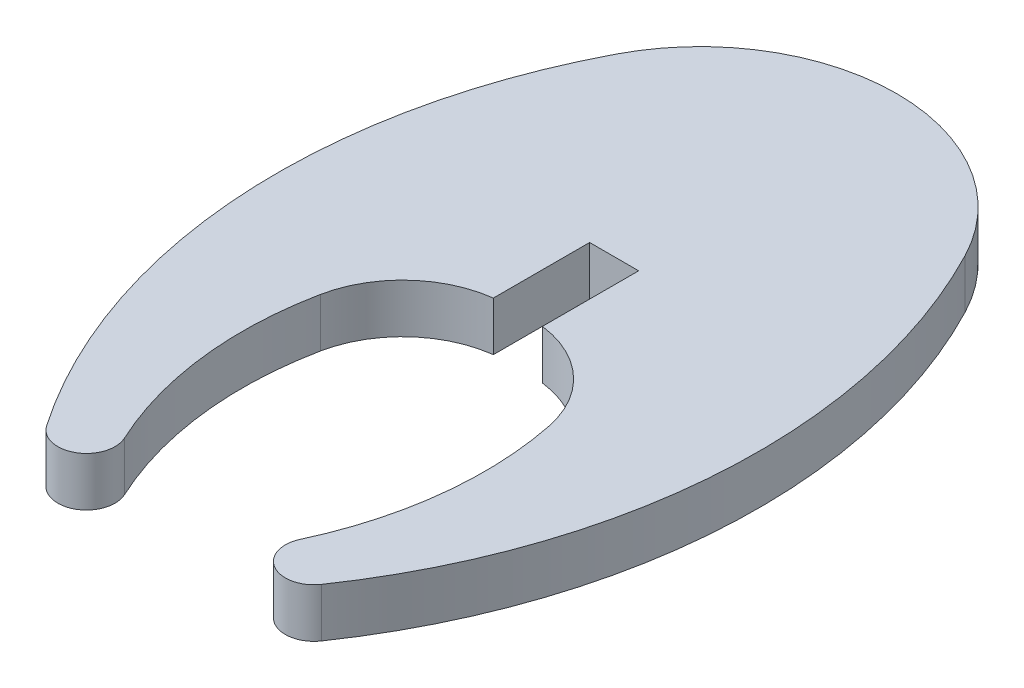
ISO-10303-21;
HEADER;
FILE_DESCRIPTION(('STEP AP214'),'2;1');
FILE_NAME('part.step','',(''),(''),'','','');
FILE_SCHEMA(('AUTOMOTIVE_DESIGN { 1 0 10303 214 1 1 1 1 }'));
ENDSEC;
DATA;
#1=APPLICATION_CONTEXT('core data for automotive mechanical design processes');
#2=APPLICATION_PROTOCOL_DEFINITION('international standard','automotive_design',2000,#1);
#3=PRODUCT_CONTEXT('',#1,'mechanical');
#4=PRODUCT('Part','Part','',(#3));
#5=PRODUCT_RELATED_PRODUCT_CATEGORY('part','',(#4));
#6=PRODUCT_DEFINITION_FORMATION('','',#4);
#7=PRODUCT_DEFINITION_CONTEXT('part definition',#1,'design');
#8=PRODUCT_DEFINITION('design','',#6,#7);
#9=PRODUCT_DEFINITION_SHAPE('','',#8);
#10=(LENGTH_UNIT() NAMED_UNIT(*) SI_UNIT(.MILLI.,.METRE.));
#11=(NAMED_UNIT(*) PLANE_ANGLE_UNIT() SI_UNIT($,.RADIAN.));
#12=(NAMED_UNIT(*) SI_UNIT($,.STERADIAN.) SOLID_ANGLE_UNIT());
#13=UNCERTAINTY_MEASURE_WITH_UNIT(LENGTH_MEASURE(1.E-05),#10,'distance_accuracy_value','');
#14=(GEOMETRIC_REPRESENTATION_CONTEXT(3) GLOBAL_UNCERTAINTY_ASSIGNED_CONTEXT((#13)) GLOBAL_UNIT_ASSIGNED_CONTEXT((#10,
#11,#12)) REPRESENTATION_CONTEXT('',''));
#15=CARTESIAN_POINT('',(0.,0.,0.));
#16=DIRECTION('',(0.,0.,1.));
#17=DIRECTION('',(1.,0.,0.));
#18=AXIS2_PLACEMENT_3D('',#15,#16,#17);
#19=CARTESIAN_POINT('',(-41998.0702575896,3.,-18196.3856532294));
#20=DIRECTION('',(0.,-1.,0.));
#21=DIRECTION('',(0.,0.,-1.));
#22=AXIS2_PLACEMENT_3D('',#19,#20,#21);
#23=CYLINDRICAL_SURFACE('',#22,36.1572377757023);
#24=CARTESIAN_POINT('',(-41998.0702575896,0.,-18196.3856532294));
#25=DIRECTION('',(0.,1.,0.));
#26=DIRECTION('',(0.,0.,1.));
#27=AXIS2_PLACEMENT_3D('',#24,#25,#26);
#28=CIRCLE('',#27,36.1572377757023);
#29=CARTESIAN_POINT('',(-41968.2504699999,0.,-18175.937521));
#30=VERTEX_POINT('',#29);
#31=CARTESIAN_POINT('',(-41965.989663,0.,-18213.064421));
#32=VERTEX_POINT('',#31);
#33=EDGE_CURVE('E155',#30,#32,#28,.T.);
#34=ORIENTED_EDGE('',*,*,#33,.T.);
#35=DIRECTION('',(0.,-1.,0.));
#36=VECTOR('',#35,1.);
#37=CARTESIAN_POINT('',(-41965.989663,3.,-18213.064421));
#38=LINE('',#37,#36);
#39=CARTESIAN_POINT('',(-41965.989663,3.,-18213.064421));
#40=VERTEX_POINT('',#39);
#41=EDGE_CURVE('E11',#40,#32,#38,.T.);
#42=ORIENTED_EDGE('',*,*,#41,.F.);
#43=CARTESIAN_POINT('',(-41998.0702575896,3.,-18196.3856532294));
#44=DIRECTION('',(0.,1.,0.));
#45=DIRECTION('',(0.,0.,1.));
#46=AXIS2_PLACEMENT_3D('',#43,#44,#45);
#47=CIRCLE('',#46,36.1572377757023);
#48=CARTESIAN_POINT('',(-41968.2504699999,3.,-18175.937521));
#49=VERTEX_POINT('',#48);
#50=EDGE_CURVE('E177',#49,#40,#47,.T.);
#51=ORIENTED_EDGE('',*,*,#50,.F.);
#52=DIRECTION('',(0.,-1.,0.));
#53=VECTOR('',#52,1.);
#54=CARTESIAN_POINT('',(-41968.2504699999,3.,-18175.937521));
#55=LINE('',#54,#53);
#56=EDGE_CURVE('E151',#49,#30,#55,.T.);
#57=ORIENTED_EDGE('',*,*,#56,.T.);
#58=EDGE_LOOP('',(#34,#42,#51,#57));
#59=FACE_BOUND('',#58,.T.);
#60=ADVANCED_FACE('F35',(#59),#23,.T.);
#61=CARTESIAN_POINT('',(-41976.6562495312,3.,-18207.5156249999));
#62=DIRECTION('',(0.,-1.,0.));
#63=DIRECTION('',(0.,0.,-1.));
#64=AXIS2_PLACEMENT_3D('',#61,#62,#63);
#65=CYLINDRICAL_SURFACE('',#64,12.0235271562988);
#66=CARTESIAN_POINT('',(-41976.6562495312,0.,-18207.5156249999));
#67=DIRECTION('',(0.,1.,0.));
#68=DIRECTION('',(0.,0.,1.));
#69=AXIS2_PLACEMENT_3D('',#66,#67,#68);
#70=CIRCLE('',#69,12.0235271562988);
#71=CARTESIAN_POINT('',(-41987.324131,0.,-18213.061931));
#72=VERTEX_POINT('',#71);
#73=EDGE_CURVE('E158',#32,#72,#70,.T.);
#74=ORIENTED_EDGE('',*,*,#73,.T.);
#75=DIRECTION('',(0.,-1.,0.));
#76=VECTOR('',#75,1.);
#77=CARTESIAN_POINT('',(-41987.324131,3.,-18213.061931));
#78=LINE('',#77,#76);
#79=CARTESIAN_POINT('',(-41987.324131,3.,-18213.061931));
#80=VERTEX_POINT('',#79);
#81=EDGE_CURVE('E43',#80,#72,#78,.T.);
#82=ORIENTED_EDGE('',*,*,#81,.F.);
#83=CARTESIAN_POINT('',(-41976.6562495312,3.,-18207.5156249999));
#84=DIRECTION('',(0.,1.,0.));
#85=DIRECTION('',(0.,0.,1.));
#86=AXIS2_PLACEMENT_3D('',#83,#84,#85);
#87=CIRCLE('',#86,12.0235271562988);
#88=EDGE_CURVE('E106',#40,#80,#87,.T.);
#89=ORIENTED_EDGE('',*,*,#88,.F.);
#90=ORIENTED_EDGE('',*,*,#41,.T.);
#91=EDGE_LOOP('',(#74,#82,#89,#90));
#92=FACE_BOUND('',#91,.T.);
#93=ADVANCED_FACE('F255',(#92),#65,.T.);
#94=CARTESIAN_POINT('',(-41955.2460944996,3.,-18196.3867271876));
#95=DIRECTION('',(0.,-1.,0.));
#96=DIRECTION('',(0.,0.,-1.));
#97=AXIS2_PLACEMENT_3D('',#94,#95,#96);
#98=CYLINDRICAL_SURFACE('',#97,36.1533241612001);
#99=CARTESIAN_POINT('',(-41955.2460944996,0.,-18196.3867271876));
#100=DIRECTION('',(0.,1.,0.));
#101=DIRECTION('',(0.,0.,1.));
#102=AXIS2_PLACEMENT_3D('',#99,#100,#101);
#103=CIRCLE('',#102,36.1533241612001);
#104=CARTESIAN_POINT('',(-41985.058644,0.,-18175.934961));
#105=VERTEX_POINT('',#104);
#106=EDGE_CURVE('E160',#72,#105,#103,.T.);
#107=ORIENTED_EDGE('',*,*,#106,.T.);
#108=DIRECTION('',(0.,-1.,0.));
#109=VECTOR('',#108,1.);
#110=CARTESIAN_POINT('',(-41985.058644,3.,-18175.934961));
#111=LINE('',#110,#109);
#112=CARTESIAN_POINT('',(-41985.058644,3.,-18175.934961));
#113=VERTEX_POINT('',#112);
#114=EDGE_CURVE('E196',#113,#105,#111,.T.);
#115=ORIENTED_EDGE('',*,*,#114,.F.);
#116=CARTESIAN_POINT('',(-41955.2460944996,3.,-18196.3867271876));
#117=DIRECTION('',(0.,1.,0.));
#118=DIRECTION('',(0.,0.,1.));
#119=AXIS2_PLACEMENT_3D('',#116,#117,#118);
#120=CIRCLE('',#119,36.1533241612001);
#121=EDGE_CURVE('E204',#80,#113,#120,.T.);
#122=ORIENTED_EDGE('',*,*,#121,.F.);
#123=ORIENTED_EDGE('',*,*,#81,.T.);
#124=EDGE_LOOP('',(#107,#115,#122,#123));
#125=FACE_BOUND('',#124,.T.);
#126=ADVANCED_FACE('F202',(#125),#98,.T.);
#127=CARTESIAN_POINT('',(-41983.6131363162,3.,-18176.9258634671));
#128=DIRECTION('',(0.,-1.,0.));
#129=DIRECTION('',(0.,0.,-1.));
#130=AXIS2_PLACEMENT_3D('',#127,#128,#129);
#131=CYLINDRICAL_SURFACE('',#130,1.75253535289747);
#132=CARTESIAN_POINT('',(-41983.6131363162,0.,-18176.9258634671));
#133=DIRECTION('',(0.,1.,0.));
#134=DIRECTION('',(0.,0.,1.));
#135=AXIS2_PLACEMENT_3D('',#132,#133,#134);
#136=CIRCLE('',#135,1.75253535289747);
#137=CARTESIAN_POINT('',(-41982.023946,0.,-18177.664683));
#138=VERTEX_POINT('',#137);
#139=EDGE_CURVE('E162',#105,#138,#136,.T.);
#140=ORIENTED_EDGE('',*,*,#139,.T.);
#141=DIRECTION('',(0.,-1.,0.));
#142=VECTOR('',#141,1.);
#143=CARTESIAN_POINT('',(-41982.023946,3.,-18177.664683));
#144=LINE('',#143,#142);
#145=CARTESIAN_POINT('',(-41982.023946,3.,-18177.664683));
#146=VERTEX_POINT('',#145);
#147=EDGE_CURVE('E193',#146,#138,#144,.T.);
#148=ORIENTED_EDGE('',*,*,#147,.F.);
#149=CARTESIAN_POINT('',(-41983.6131363162,3.,-18176.9258634671));
#150=DIRECTION('',(0.,1.,0.));
#151=DIRECTION('',(0.,0.,1.));
#152=AXIS2_PLACEMENT_3D('',#149,#150,#151);
#153=CIRCLE('',#152,1.75253535289747);
#154=EDGE_CURVE('E222',#113,#146,#153,.T.);
#155=ORIENTED_EDGE('',*,*,#154,.F.);
#156=ORIENTED_EDGE('',*,*,#114,.T.);
#157=EDGE_LOOP('',(#140,#148,#155,#156));
#158=FACE_BOUND('',#157,.T.);
#159=ADVANCED_FACE('F213',(#158),#131,.T.);
#160=CARTESIAN_POINT('',(-41962.121035298,3.,-18186.9331000175));
#161=DIRECTION('',(0.,-1.,0.));
#162=DIRECTION('',(0.,0.,-1.));
#163=AXIS2_PLACEMENT_3D('',#160,#161,#162);
#164=CYLINDRICAL_SURFACE('',#163,21.9551681484013);
#165=CARTESIAN_POINT('',(-41962.121035298,0.,-18186.9331000175));
#166=DIRECTION('',(0.,-1.,0.));
#167=DIRECTION('',(0.,0.,1.));
#168=AXIS2_PLACEMENT_3D('',#165,#166,#167);
#169=CIRCLE('',#168,21.9551681484013);
#170=CARTESIAN_POINT('',(-41983.641789,0.,-18191.278968));
#171=VERTEX_POINT('',#170);
#172=EDGE_CURVE('E164',#138,#171,#169,.T.);
#173=ORIENTED_EDGE('',*,*,#172,.T.);
#174=DIRECTION('',(0.,-1.,0.));
#175=VECTOR('',#174,1.);
#176=CARTESIAN_POINT('',(-41983.641789,3.,-18191.278968));
#177=LINE('',#176,#175);
#178=CARTESIAN_POINT('',(-41983.641789,3.,-18191.278968));
#179=VERTEX_POINT('',#178);
#180=EDGE_CURVE('E190',#179,#171,#177,.T.);
#181=ORIENTED_EDGE('',*,*,#180,.F.);
#182=CARTESIAN_POINT('',(-41962.121035298,3.,-18186.9331000175));
#183=DIRECTION('',(0.,-1.,0.));
#184=DIRECTION('',(0.,0.,1.));
#185=AXIS2_PLACEMENT_3D('',#182,#183,#184);
#186=CIRCLE('',#185,21.9551681484013);
#187=EDGE_CURVE('E219',#146,#179,#186,.T.);
#188=ORIENTED_EDGE('',*,*,#187,.F.);
#189=ORIENTED_EDGE('',*,*,#147,.T.);
#190=EDGE_LOOP('',(#173,#181,#188,#189));
#191=FACE_BOUND('',#190,.T.);
#192=ADVANCED_FACE('F217',(#191),#164,.F.);
#193=CARTESIAN_POINT('',(-41977.3659910672,3.,-18190.0147822466));
#194=DIRECTION('',(0.,-1.,0.));
#195=DIRECTION('',(0.,0.,-1.));
#196=AXIS2_PLACEMENT_3D('',#193,#194,#195);
#197=CYLINDRICAL_SURFACE('',#196,6.40185951989809);
#198=CARTESIAN_POINT('',(-41977.3659910672,0.,-18190.0147822466));
#199=DIRECTION('',(0.,-1.,0.));
#200=DIRECTION('',(0.,0.,1.));
#201=AXIS2_PLACEMENT_3D('',#198,#199,#200);
#202=CIRCLE('',#201,6.40185951989809);
#203=CARTESIAN_POINT('',(-41978.160978,0.,-18196.367089));
#204=VERTEX_POINT('',#203);
#205=EDGE_CURVE('E166',#171,#204,#202,.T.);
#206=ORIENTED_EDGE('',*,*,#205,.T.);
#207=DIRECTION('',(0.,-1.,0.));
#208=VECTOR('',#207,1.);
#209=CARTESIAN_POINT('',(-41978.160978,3.,-18196.367089));
#210=LINE('',#209,#208);
#211=CARTESIAN_POINT('',(-41978.160978,3.,-18196.367089));
#212=VERTEX_POINT('',#211);
#213=EDGE_CURVE('E187',#212,#204,#210,.T.);
#214=ORIENTED_EDGE('',*,*,#213,.F.);
#215=CARTESIAN_POINT('',(-41977.3659910672,3.,-18190.0147822466));
#216=DIRECTION('',(0.,-1.,0.));
#217=DIRECTION('',(0.,0.,1.));
#218=AXIS2_PLACEMENT_3D('',#215,#216,#217);
#219=CIRCLE('',#218,6.40185951989809);
#220=EDGE_CURVE('E221',#179,#212,#219,.T.);
#221=ORIENTED_EDGE('',*,*,#220,.F.);
#222=ORIENTED_EDGE('',*,*,#180,.T.);
#223=EDGE_LOOP('',(#206,#214,#221,#222));
#224=FACE_BOUND('',#223,.T.);
#225=ADVANCED_FACE('F268',(#224),#197,.F.);
#226=CARTESIAN_POINT('',(-41978.160978,3.,-18196.367089));
#227=DIRECTION('',(-0.999999990257634,0.,-0.000139587721875502));
#228=DIRECTION('',(-0.000139587721875502,0.,0.999999990257634));
#229=AXIS2_PLACEMENT_3D('',#226,#227,#228);
#230=PLANE('',#229);
#231=DIRECTION('',(0.000139587721875502,0.,-0.999999990257634));
#232=VECTOR('',#231,1.);
#233=CARTESIAN_POINT('',(-41978.160978,0.,-18196.367089));
#234=LINE('',#233,#232);
#235=CARTESIAN_POINT('',(-41978.160156,0.,-18202.255859));
#236=VERTEX_POINT('',#235);
#237=EDGE_CURVE('E168',#204,#236,#234,.T.);
#238=ORIENTED_EDGE('',*,*,#237,.T.);
#239=DIRECTION('',(0.,-1.,0.));
#240=VECTOR('',#239,1.);
#241=CARTESIAN_POINT('',(-41978.160156,3.,-18202.255859));
#242=LINE('',#241,#240);
#243=CARTESIAN_POINT('',(-41978.160156,3.,-18202.255859));
#244=VERTEX_POINT('',#243);
#245=EDGE_CURVE('E184',#244,#236,#242,.T.);
#246=ORIENTED_EDGE('',*,*,#245,.F.);
#247=DIRECTION('',(0.000139587721875502,0.,-0.999999990257634));
#248=VECTOR('',#247,1.);
#249=CARTESIAN_POINT('',(-41978.160978,3.,-18196.367089));
#250=LINE('',#249,#248);
#251=EDGE_CURVE('E224',#212,#244,#250,.T.);
#252=ORIENTED_EDGE('',*,*,#251,.F.);
#253=ORIENTED_EDGE('',*,*,#213,.T.);
#254=EDGE_LOOP('',(#238,#246,#252,#253));
#255=FACE_BOUND('',#254,.T.);
#256=ADVANCED_FACE('F271',(#255),#230,.F.);
#257=CARTESIAN_POINT('',(-41978.160156,3.,-18202.255859));
#258=DIRECTION('',(0.,0.,-1.));
#259=DIRECTION('',(-1.,0.,0.));
#260=AXIS2_PLACEMENT_3D('',#257,#258,#259);
#261=PLANE('',#260);
#262=DIRECTION('',(1.,0.,0.));
#263=VECTOR('',#262,1.);
#264=CARTESIAN_POINT('',(-41978.160156,0.,-18202.255859));
#265=LINE('',#264,#263);
#266=CARTESIAN_POINT('',(-41975.160156,0.,-18202.255859));
#267=VERTEX_POINT('',#266);
#268=EDGE_CURVE('E170',#236,#267,#265,.T.);
#269=ORIENTED_EDGE('',*,*,#268,.T.);
#270=DIRECTION('',(0.,-1.,0.));
#271=VECTOR('',#270,1.);
#272=CARTESIAN_POINT('',(-41975.160156,3.,-18202.255859));
#273=LINE('',#272,#271);
#274=CARTESIAN_POINT('',(-41975.160156,3.,-18202.255859));
#275=VERTEX_POINT('',#274);
#276=EDGE_CURVE('E181',#275,#267,#273,.T.);
#277=ORIENTED_EDGE('',*,*,#276,.F.);
#278=DIRECTION('',(1.,0.,0.));
#279=VECTOR('',#278,1.);
#280=CARTESIAN_POINT('',(-41978.160156,3.,-18202.255859));
#281=LINE('',#280,#279);
#282=EDGE_CURVE('E230',#244,#275,#281,.T.);
#283=ORIENTED_EDGE('',*,*,#282,.F.);
#284=ORIENTED_EDGE('',*,*,#245,.T.);
#285=EDGE_LOOP('',(#269,#277,#283,#284));
#286=FACE_BOUND('',#285,.T.);
#287=ADVANCED_FACE('F236',(#286),#261,.F.);
#288=CARTESIAN_POINT('',(-41975.160156,3.,-18202.255859));
#289=DIRECTION('',(1.,0.,-2.41325288877733E-12));
#290=DIRECTION('',(-2.41325288877733E-12,0.,-1.));
#291=AXIS2_PLACEMENT_3D('',#288,#289,#290);
#292=PLANE('',#291);
#293=DIRECTION('',(2.41325288877733E-12,0.,1.));
#294=VECTOR('',#293,1.);
#295=CARTESIAN_POINT('',(-41975.160156,0.,-18202.255859));
#296=LINE('',#295,#294);
#297=CARTESIAN_POINT('',(-41975.160156,0.,-18196.3671869999));
#298=VERTEX_POINT('',#297);
#299=EDGE_CURVE('E172',#267,#298,#296,.T.);
#300=ORIENTED_EDGE('',*,*,#299,.T.);
#301=DIRECTION('',(0.,-1.,0.));
#302=VECTOR('',#301,1.);
#303=CARTESIAN_POINT('',(-41975.160156,3.,-18196.3671869999));
#304=LINE('',#303,#302);
#305=CARTESIAN_POINT('',(-41975.160156,3.,-18196.3671869999));
#306=VERTEX_POINT('',#305);
#307=EDGE_CURVE('E146',#306,#298,#304,.T.);
#308=ORIENTED_EDGE('',*,*,#307,.F.);
#309=DIRECTION('',(2.41325288877733E-12,0.,1.));
#310=VECTOR('',#309,1.);
#311=CARTESIAN_POINT('',(-41975.160156,3.,-18202.255859));
#312=LINE('',#311,#310);
#313=EDGE_CURVE('E137',#275,#306,#312,.T.);
#314=ORIENTED_EDGE('',*,*,#313,.F.);
#315=ORIENTED_EDGE('',*,*,#276,.T.);
#316=EDGE_LOOP('',(#300,#308,#314,#315));
#317=FACE_BOUND('',#316,.T.);
#318=ADVANCED_FACE('F240',(#317),#292,.F.);
#319=CARTESIAN_POINT('',(-41975.9501292565,3.,-18190.0125629573));
#320=DIRECTION('',(0.,-1.,0.));
#321=DIRECTION('',(0.,0.,-1.));
#322=AXIS2_PLACEMENT_3D('',#319,#320,#321);
#323=CYLINDRICAL_SURFACE('',#322,6.40353843350038);
#324=CARTESIAN_POINT('',(-41975.9501292565,0.,-18190.0125629573));
#325=DIRECTION('',(0.,-1.,0.));
#326=DIRECTION('',(0.,0.,1.));
#327=AXIS2_PLACEMENT_3D('',#324,#325,#326);
#328=CIRCLE('',#327,6.40353843350038);
#329=CARTESIAN_POINT('',(-41969.673261,0.,-18191.279934));
#330=VERTEX_POINT('',#329);
#331=EDGE_CURVE('E145',#298,#330,#328,.T.);
#332=ORIENTED_EDGE('',*,*,#331,.T.);
#333=DIRECTION('',(0.,-1.,0.));
#334=VECTOR('',#333,1.);
#335=CARTESIAN_POINT('',(-41969.673261,3.,-18191.279934));
#336=LINE('',#335,#334);
#337=CARTESIAN_POINT('',(-41969.673261,3.,-18191.279934));
#338=VERTEX_POINT('',#337);
#339=EDGE_CURVE('E142',#338,#330,#336,.T.);
#340=ORIENTED_EDGE('',*,*,#339,.F.);
#341=CARTESIAN_POINT('',(-41975.9501292565,3.,-18190.0125629573));
#342=DIRECTION('',(0.,-1.,0.));
#343=DIRECTION('',(0.,0.,1.));
#344=AXIS2_PLACEMENT_3D('',#341,#342,#343);
#345=CIRCLE('',#344,6.40353843350038);
#346=EDGE_CURVE('E131',#306,#338,#345,.T.);
#347=ORIENTED_EDGE('',*,*,#346,.F.);
#348=ORIENTED_EDGE('',*,*,#307,.T.);
#349=EDGE_LOOP('',(#332,#340,#347,#348));
#350=FACE_BOUND('',#349,.T.);
#351=ADVANCED_FACE('F143',(#350),#323,.F.);
#352=CARTESIAN_POINT('',(-41991.1918414946,3.,-18186.9299221392));
#353=DIRECTION('',(0.,-1.,0.));
#354=DIRECTION('',(0.,0.,-1.));
#355=AXIS2_PLACEMENT_3D('',#352,#353,#354);
#356=CYLINDRICAL_SURFACE('',#355,21.9538586514995);
#357=CARTESIAN_POINT('',(-41991.1918414946,0.,-18186.9299221392));
#358=DIRECTION('',(0.,-1.,0.));
#359=DIRECTION('',(0.,0.,1.));
#360=AXIS2_PLACEMENT_3D('',#357,#358,#359);
#361=CIRCLE('',#360,21.9538586514995);
#362=CARTESIAN_POINT('',(-41971.287793,0.,-18177.667052));
#363=VERTEX_POINT('',#362);
#364=EDGE_CURVE('E92',#330,#363,#361,.T.);
#365=ORIENTED_EDGE('',*,*,#364,.T.);
#366=DIRECTION('',(0.,-1.,0.));
#367=VECTOR('',#366,1.);
#368=CARTESIAN_POINT('',(-41971.287793,3.,-18177.667052));
#369=LINE('',#368,#367);
#370=CARTESIAN_POINT('',(-41971.287793,3.,-18177.667052));
#371=VERTEX_POINT('',#370);
#372=EDGE_CURVE('E147',#371,#363,#369,.T.);
#373=ORIENTED_EDGE('',*,*,#372,.F.);
#374=CARTESIAN_POINT('',(-41991.1918414946,3.,-18186.9299221392));
#375=DIRECTION('',(0.,-1.,0.));
#376=DIRECTION('',(0.,0.,1.));
#377=AXIS2_PLACEMENT_3D('',#374,#375,#376);
#378=CIRCLE('',#377,21.9538586514995);
#379=EDGE_CURVE('E135',#338,#371,#378,.T.);
#380=ORIENTED_EDGE('',*,*,#379,.F.);
#381=ORIENTED_EDGE('',*,*,#339,.T.);
#382=EDGE_LOOP('',(#365,#373,#380,#381));
#383=FACE_BOUND('',#382,.T.);
#384=ADVANCED_FACE('F149',(#383),#356,.F.);
#385=CARTESIAN_POINT('',(-41969.6962743058,3.,-18176.9302349621));
#386=DIRECTION('',(0.,-1.,0.));
#387=DIRECTION('',(0.,0.,-1.));
#388=AXIS2_PLACEMENT_3D('',#385,#386,#387);
#389=CYLINDRICAL_SURFACE('',#388,1.75380475010088);
#390=CARTESIAN_POINT('',(-41969.6962743058,0.,-18176.9302349621));
#391=DIRECTION('',(0.,1.,0.));
#392=DIRECTION('',(0.,0.,1.));
#393=AXIS2_PLACEMENT_3D('',#390,#391,#392);
#394=CIRCLE('',#393,1.75380475010088);
#395=EDGE_CURVE('E98',#363,#30,#394,.T.);
#396=ORIENTED_EDGE('',*,*,#395,.T.);
#397=ORIENTED_EDGE('',*,*,#56,.F.);
#398=CARTESIAN_POINT('',(-41969.6962743058,3.,-18176.9302349621));
#399=DIRECTION('',(0.,1.,0.));
#400=DIRECTION('',(0.,0.,1.));
#401=AXIS2_PLACEMENT_3D('',#398,#399,#400);
#402=CIRCLE('',#401,1.75380475010088);
#403=EDGE_CURVE('E51',#371,#49,#402,.T.);
#404=ORIENTED_EDGE('',*,*,#403,.F.);
#405=ORIENTED_EDGE('',*,*,#372,.T.);
#406=EDGE_LOOP('',(#396,#397,#404,#405));
#407=FACE_BOUND('',#406,.T.);
#408=ADVANCED_FACE('F244',(#407),#389,.T.);
#409=CARTESIAN_POINT('',(-41998.0702575896,3.,-18196.3856532294));
#410=DIRECTION('',(0.,1.,0.));
#411=DIRECTION('',(0.,0.,1.));
#412=AXIS2_PLACEMENT_3D('',#409,#410,#411);
#413=PLANE('',#412);
#414=ORIENTED_EDGE('',*,*,#50,.T.);
#415=ORIENTED_EDGE('',*,*,#88,.T.);
#416=ORIENTED_EDGE('',*,*,#121,.T.);
#417=ORIENTED_EDGE('',*,*,#154,.T.);
#418=ORIENTED_EDGE('',*,*,#187,.T.);
#419=ORIENTED_EDGE('',*,*,#220,.T.);
#420=ORIENTED_EDGE('',*,*,#251,.T.);
#421=ORIENTED_EDGE('',*,*,#282,.T.);
#422=ORIENTED_EDGE('',*,*,#313,.T.);
#423=ORIENTED_EDGE('',*,*,#346,.T.);
#424=ORIENTED_EDGE('',*,*,#379,.T.);
#425=ORIENTED_EDGE('',*,*,#403,.T.);
#426=EDGE_LOOP('',(#414,#415,#416,#417,#418,#419,#420,#421,#422,#423,#424,#425));
#427=FACE_BOUND('',#426,.T.);
#428=ADVANCED_FACE('F133',(#427),#413,.T.);
#429=CARTESIAN_POINT('',(-41998.0702575896,0.,-18196.3856532294));
#430=DIRECTION('',(0.,1.,0.));
#431=DIRECTION('',(0.,0.,1.));
#432=AXIS2_PLACEMENT_3D('',#429,#430,#431);
#433=PLANE('',#432);
#434=ORIENTED_EDGE('',*,*,#33,.F.);
#435=ORIENTED_EDGE('',*,*,#395,.F.);
#436=ORIENTED_EDGE('',*,*,#364,.F.);
#437=ORIENTED_EDGE('',*,*,#331,.F.);
#438=ORIENTED_EDGE('',*,*,#299,.F.);
#439=ORIENTED_EDGE('',*,*,#268,.F.);
#440=ORIENTED_EDGE('',*,*,#237,.F.);
#441=ORIENTED_EDGE('',*,*,#205,.F.);
#442=ORIENTED_EDGE('',*,*,#172,.F.);
#443=ORIENTED_EDGE('',*,*,#139,.F.);
#444=ORIENTED_EDGE('',*,*,#106,.F.);
#445=ORIENTED_EDGE('',*,*,#73,.F.);
#446=EDGE_LOOP('',(#434,#435,#436,#437,#438,#439,#440,#441,#442,#443,#444,#445));
#447=FACE_BOUND('',#446,.T.);
#448=ADVANCED_FACE('F208',(#447),#433,.F.);
#449=CLOSED_SHELL('',(#60,#93,#126,#159,#192,#225,#256,#287,#318,#351,#384,#408,#428,#448));
#450=MANIFOLD_SOLID_BREP('B2',#449);
#451=ADVANCED_BREP_SHAPE_REPRESENTATION('',(#18,#450),#14);
#452=SHAPE_DEFINITION_REPRESENTATION(#9,#451);
ENDSEC;
END-ISO-10303-21;
